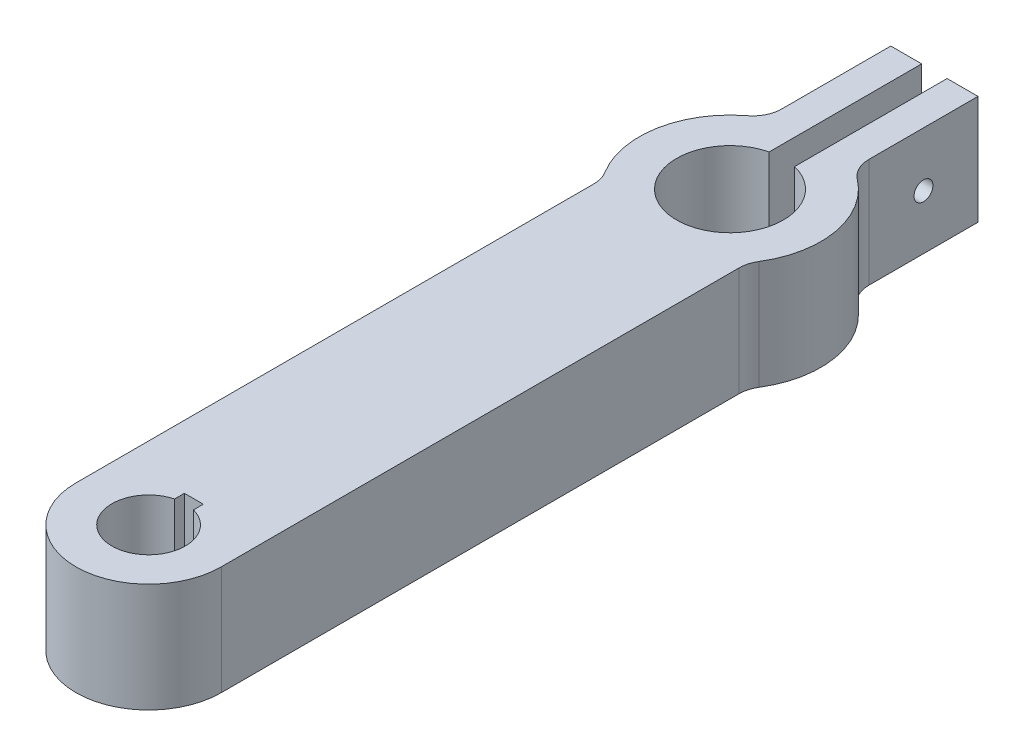
ISO-10303-21;
HEADER;
FILE_DESCRIPTION(('STEP AP214'),'2;1');
FILE_NAME('part.step','',(''),(''),'','','');
FILE_SCHEMA(('AUTOMOTIVE_DESIGN { 1 0 10303 214 1 1 1 1 }'));
ENDSEC;
DATA;
#1=APPLICATION_CONTEXT('core data for automotive mechanical design processes');
#2=APPLICATION_PROTOCOL_DEFINITION('international standard','automotive_design',2000,#1);
#3=PRODUCT_CONTEXT('',#1,'mechanical');
#4=PRODUCT('Part','Part','',(#3));
#5=PRODUCT_RELATED_PRODUCT_CATEGORY('part','',(#4));
#6=PRODUCT_DEFINITION_FORMATION('','',#4);
#7=PRODUCT_DEFINITION_CONTEXT('part definition',#1,'design');
#8=PRODUCT_DEFINITION('design','',#6,#7);
#9=PRODUCT_DEFINITION_SHAPE('','',#8);
#10=(LENGTH_UNIT() NAMED_UNIT(*) SI_UNIT(.MILLI.,.METRE.));
#11=(NAMED_UNIT(*) PLANE_ANGLE_UNIT() SI_UNIT($,.RADIAN.));
#12=(NAMED_UNIT(*) SI_UNIT($,.STERADIAN.) SOLID_ANGLE_UNIT());
#13=UNCERTAINTY_MEASURE_WITH_UNIT(LENGTH_MEASURE(1.E-05),#10,'distance_accuracy_value','');
#14=(GEOMETRIC_REPRESENTATION_CONTEXT(3) GLOBAL_UNCERTAINTY_ASSIGNED_CONTEXT((#13)) GLOBAL_UNIT_ASSIGNED_CONTEXT((#10,
#11,#12)) REPRESENTATION_CONTEXT('',''));
#15=CARTESIAN_POINT('',(0.,0.,0.));
#16=DIRECTION('',(0.,0.,1.));
#17=DIRECTION('',(1.,0.,0.));
#18=AXIS2_PLACEMENT_3D('',#15,#16,#17);
#19=CARTESIAN_POINT('',(-11.557,5.08,-85.725));
#20=DIRECTION('',(0.,0.,1.));
#21=DIRECTION('',(1.,0.,0.));
#22=AXIS2_PLACEMENT_3D('',#19,#20,#21);
#23=PLANE('',#22);
#24=DIRECTION('',(-1.,0.,0.));
#25=VECTOR('',#24,1.);
#26=CARTESIAN_POINT('',(-11.557,0.,-85.725));
#27=LINE('',#26,#25);
#28=CARTESIAN_POINT('',(11.557,0.,-85.725));
#29=VERTEX_POINT('',#28);
#30=CARTESIAN_POINT('',(4.7625,0.,-85.725));
#31=VERTEX_POINT('',#30);
#32=EDGE_CURVE('E500',#29,#31,#27,.T.);
#33=ORIENTED_EDGE('',*,*,#32,.T.);
#34=DIRECTION('',(0.,-1.,0.));
#35=VECTOR('',#34,1.);
#36=CARTESIAN_POINT('',(4.7625,5.08,-85.725));
#37=LINE('',#36,#35);
#38=CARTESIAN_POINT('',(4.7625,5.08,-85.725));
#39=VERTEX_POINT('',#38);
#40=EDGE_CURVE('E493',#39,#31,#37,.T.);
#41=ORIENTED_EDGE('',*,*,#40,.F.);
#42=DIRECTION('',(-1.,0.,0.));
#43=VECTOR('',#42,1.);
#44=CARTESIAN_POINT('',(-11.557,5.08,-85.725));
#45=LINE('',#44,#43);
#46=CARTESIAN_POINT('',(11.557,5.08,-85.725));
#47=VERTEX_POINT('',#46);
#48=EDGE_CURVE('E480',#47,#39,#45,.T.);
#49=ORIENTED_EDGE('',*,*,#48,.F.);
#50=DIRECTION('',(0.,-1.,0.));
#51=VECTOR('',#50,1.);
#52=CARTESIAN_POINT('',(11.557,5.08,-85.725));
#53=LINE('',#52,#51);
#54=EDGE_CURVE('E505',#47,#29,#53,.T.);
#55=ORIENTED_EDGE('',*,*,#54,.T.);
#56=EDGE_LOOP('',(#33,#41,#49,#55));
#57=FACE_BOUND('',#56,.T.);
#58=ADVANCED_FACE('F34',(#57),#23,.F.);
#59=CARTESIAN_POINT('',(35.56,38.1,-181.020403520352));
#60=DIRECTION('',(0.,-1.,0.));
#61=DIRECTION('',(0.,0.,-1.));
#62=AXIS2_PLACEMENT_3D('',#59,#60,#61);
#63=PLANE('',#62);
#64=CARTESIAN_POINT('',(35.56,38.1,-181.020403520352));
#65=DIRECTION('',(0.,-1.,0.));
#66=DIRECTION('',(0.,0.,-1.));
#67=AXIS2_PLACEMENT_3D('',#64,#65,#66);
#68=CIRCLE('',#67,10.16);
#69=CARTESIAN_POINT('',(25.4,38.1,-181.020403520352));
#70=VERTEX_POINT('',#69);
#71=CARTESIAN_POINT('',(26.9393939393939,38.1,-186.397275394206));
#72=VERTEX_POINT('',#71);
#73=EDGE_CURVE('E252',#70,#72,#68,.T.);
#74=ORIENTED_EDGE('',*,*,#73,.T.);
#75=CARTESIAN_POINT('',(0.,38.1,-203.2));
#76=DIRECTION('',(0.,1.,0.));
#77=DIRECTION('',(0.,0.,1.));
#78=AXIS2_PLACEMENT_3D('',#75,#76,#77);
#79=CIRCLE('',#78,31.75);
#80=CARTESIAN_POINT('',(19.2424242424242,38.1,-228.454536409813));
#81=VERTEX_POINT('',#80);
#82=EDGE_CURVE('E255',#72,#81,#79,.T.);
#83=ORIENTED_EDGE('',*,*,#82,.T.);
#84=CARTESIAN_POINT('',(25.4,38.1,-236.535988060953));
#85=DIRECTION('',(0.,-1.,0.));
#86=DIRECTION('',(0.,0.,1.));
#87=AXIS2_PLACEMENT_3D('',#84,#85,#86);
#88=CIRCLE('',#87,10.16);
#89=CARTESIAN_POINT('',(15.24,38.1,-236.535988060953));
#90=VERTEX_POINT('',#89);
#91=EDGE_CURVE('E258',#81,#90,#88,.T.);
#92=ORIENTED_EDGE('',*,*,#91,.T.);
#93=DIRECTION('',(0.,0.,-1.));
#94=VECTOR('',#93,1.);
#95=CARTESIAN_POINT('',(15.24,38.1,-274.635988060953));
#96=LINE('',#95,#94);
#97=CARTESIAN_POINT('',(15.24,38.1,-274.635988060953));
#98=VERTEX_POINT('',#97);
#99=EDGE_CURVE('E260',#90,#98,#96,.T.);
#100=ORIENTED_EDGE('',*,*,#99,.T.);
#101=DIRECTION('',(-1.,0.,0.));
#102=VECTOR('',#101,1.);
#103=CARTESIAN_POINT('',(4.445,38.1,-274.635988060953));
#104=LINE('',#103,#102);
#105=CARTESIAN_POINT('',(4.445,38.1,-274.635988060953));
#106=VERTEX_POINT('',#105);
#107=EDGE_CURVE('E262',#98,#106,#104,.T.);
#108=ORIENTED_EDGE('',*,*,#107,.T.);
#109=DIRECTION('',(0.,0.,1.));
#110=VECTOR('',#109,1.);
#111=CARTESIAN_POINT('',(4.445,38.1,-274.635988060953));
#112=LINE('',#111,#110);
#113=CARTESIAN_POINT('',(4.44499999999998,38.1,-221.332113390336));
#114=VERTEX_POINT('',#113);
#115=EDGE_CURVE('E264',#106,#114,#112,.T.);
#116=ORIENTED_EDGE('',*,*,#115,.T.);
#117=CARTESIAN_POINT('',(0.,38.1,-203.2));
#118=DIRECTION('',(0.,-1.,0.));
#119=DIRECTION('',(0.,0.,1.));
#120=AXIS2_PLACEMENT_3D('',#117,#118,#119);
#121=CIRCLE('',#120,18.669);
#122=CARTESIAN_POINT('',(-4.44499999999999,38.1,-221.332113390336));
#123=VERTEX_POINT('',#122);
#124=EDGE_CURVE('E266',#114,#123,#121,.T.);
#125=ORIENTED_EDGE('',*,*,#124,.T.);
#126=DIRECTION('',(0.,0.,-1.));
#127=VECTOR('',#126,1.);
#128=CARTESIAN_POINT('',(-4.445,38.1,-274.635988060953));
#129=LINE('',#128,#127);
#130=CARTESIAN_POINT('',(-4.445,38.1,-274.635988060953));
#131=VERTEX_POINT('',#130);
#132=EDGE_CURVE('E268',#123,#131,#129,.T.);
#133=ORIENTED_EDGE('',*,*,#132,.T.);
#134=DIRECTION('',(-1.,0.,0.));
#135=VECTOR('',#134,1.);
#136=CARTESIAN_POINT('',(-4.445,38.1,-274.635988060953));
#137=LINE('',#136,#135);
#138=CARTESIAN_POINT('',(-15.24,38.1,-274.635988060953));
#139=VERTEX_POINT('',#138);
#140=EDGE_CURVE('E270',#131,#139,#137,.T.);
#141=ORIENTED_EDGE('',*,*,#140,.T.);
#142=DIRECTION('',(0.,0.,1.));
#143=VECTOR('',#142,1.);
#144=CARTESIAN_POINT('',(-15.24,38.1,-274.635988060953));
#145=LINE('',#144,#143);
#146=CARTESIAN_POINT('',(-15.24,38.1,-236.535988060953));
#147=VERTEX_POINT('',#146);
#148=EDGE_CURVE('E272',#139,#147,#145,.T.);
#149=ORIENTED_EDGE('',*,*,#148,.T.);
#150=CARTESIAN_POINT('',(-25.4,38.1,-236.535988060953));
#151=DIRECTION('',(0.,-1.,0.));
#152=DIRECTION('',(0.,0.,-1.));
#153=AXIS2_PLACEMENT_3D('',#150,#151,#152);
#154=CIRCLE('',#153,10.16);
#155=CARTESIAN_POINT('',(-19.2424242424242,38.1,-228.454536409813));
#156=VERTEX_POINT('',#155);
#157=EDGE_CURVE('E274',#147,#156,#154,.T.);
#158=ORIENTED_EDGE('',*,*,#157,.T.);
#159=CARTESIAN_POINT('',(0.,38.1,-203.2));
#160=DIRECTION('',(0.,1.,0.));
#161=DIRECTION('',(0.,0.,1.));
#162=AXIS2_PLACEMENT_3D('',#159,#160,#161);
#163=CIRCLE('',#162,31.75);
#164=CARTESIAN_POINT('',(-26.9393939393939,38.1,-186.397275394206));
#165=VERTEX_POINT('',#164);
#166=EDGE_CURVE('E276',#156,#165,#163,.T.);
#167=ORIENTED_EDGE('',*,*,#166,.T.);
#168=CARTESIAN_POINT('',(-35.56,38.1,-181.020403520352));
#169=DIRECTION('',(0.,-1.,0.));
#170=DIRECTION('',(0.,0.,1.));
#171=AXIS2_PLACEMENT_3D('',#168,#169,#170);
#172=CIRCLE('',#171,10.16);
#173=CARTESIAN_POINT('',(-25.4,38.1,-181.020403520352));
#174=VERTEX_POINT('',#173);
#175=EDGE_CURVE('E278',#165,#174,#172,.T.);
#176=ORIENTED_EDGE('',*,*,#175,.T.);
#177=DIRECTION('',(0.,0.,1.));
#178=VECTOR('',#177,1.);
#179=CARTESIAN_POINT('',(-25.4,38.1,0.));
#180=LINE('',#179,#178);
#181=CARTESIAN_POINT('',(-25.4,38.1,0.));
#182=VERTEX_POINT('',#181);
#183=EDGE_CURVE('E280',#174,#182,#180,.T.);
#184=ORIENTED_EDGE('',*,*,#183,.T.);
#185=CARTESIAN_POINT('',(0.,38.1,0.));
#186=DIRECTION('',(0.,1.,0.));
#187=DIRECTION('',(0.,0.,1.));
#188=AXIS2_PLACEMENT_3D('',#185,#186,#187);
#189=CIRCLE('',#188,25.4);
#190=CARTESIAN_POINT('',(25.4,38.1,0.));
#191=VERTEX_POINT('',#190);
#192=EDGE_CURVE('E282',#182,#191,#189,.T.);
#193=ORIENTED_EDGE('',*,*,#192,.T.);
#194=DIRECTION('',(0.,0.,-1.));
#195=VECTOR('',#194,1.);
#196=CARTESIAN_POINT('',(25.4,38.1,0.));
#197=LINE('',#196,#195);
#198=EDGE_CURVE('E284',#191,#70,#197,.T.);
#199=ORIENTED_EDGE('',*,*,#198,.T.);
#200=EDGE_LOOP('',(#74,#83,#92,#100,#108,#116,#125,#133,#141,#149,#158,#167,#176,#184,#193,#199));
#201=FACE_BOUND('',#200,.T.);
#202=DIRECTION('',(-1.,0.,0.));
#203=VECTOR('',#202,1.);
#204=CARTESIAN_POINT('',(3.302,38.1,-15.8237055229239));
#205=LINE('',#204,#203);
#206=CARTESIAN_POINT('',(3.302,38.1,-15.8237055229239));
#207=VERTEX_POINT('',#206);
#208=CARTESIAN_POINT('',(-3.302,38.1,-15.8237055229239));
#209=VERTEX_POINT('',#208);
#210=EDGE_CURVE('E238',#207,#209,#205,.T.);
#211=ORIENTED_EDGE('',*,*,#210,.F.);
#212=DIRECTION('',(0.,0.,-1.));
#213=VECTOR('',#212,1.);
#214=CARTESIAN_POINT('',(3.302,38.1,-15.8237055229239));
#215=LINE('',#214,#213);
#216=CARTESIAN_POINT('',(3.302,38.1,-12.3947055229239));
#217=VERTEX_POINT('',#216);
#218=EDGE_CURVE('E223',#217,#207,#215,.T.);
#219=ORIENTED_EDGE('',*,*,#218,.F.);
#220=CARTESIAN_POINT('',(0.,38.1,0.));
#221=DIRECTION('',(0.,1.,0.));
#222=DIRECTION('',(0.,0.,1.));
#223=AXIS2_PLACEMENT_3D('',#220,#221,#222);
#224=CIRCLE('',#223,12.827);
#225=CARTESIAN_POINT('',(-3.302,38.1,-12.3947055229239));
#226=VERTEX_POINT('',#225);
#227=EDGE_CURVE('E237',#226,#217,#224,.T.);
#228=ORIENTED_EDGE('',*,*,#227,.F.);
#229=DIRECTION('',(0.,0.,1.));
#230=VECTOR('',#229,1.);
#231=CARTESIAN_POINT('',(-3.302,38.1,-15.8237055229239));
#232=LINE('',#231,#230);
#233=EDGE_CURVE('E49',#209,#226,#232,.T.);
#234=ORIENTED_EDGE('',*,*,#233,.F.);
#235=EDGE_LOOP('',(#211,#219,#228,#234));
#236=FACE_BOUND('',#235,.T.);
#237=ADVANCED_FACE('F236',(#201,#236),#63,.F.);
#238=CARTESIAN_POINT('',(35.56,0.,-181.020403520352));
#239=DIRECTION('',(0.,-1.,0.));
#240=DIRECTION('',(0.,0.,-1.));
#241=AXIS2_PLACEMENT_3D('',#238,#239,#240);
#242=PLANE('',#241);
#243=DIRECTION('',(0.,0.,1.));
#244=VECTOR('',#243,1.);
#245=CARTESIAN_POINT('',(3.302,0.,-15.8237055229239));
#246=LINE('',#245,#244);
#247=CARTESIAN_POINT('',(3.302,0.,-15.8237055229239));
#248=VERTEX_POINT('',#247);
#249=CARTESIAN_POINT('',(3.30200000000001,0.,-12.3947055229239));
#250=VERTEX_POINT('',#249);
#251=EDGE_CURVE('E226',#248,#250,#246,.T.);
#252=ORIENTED_EDGE('',*,*,#251,.F.);
#253=DIRECTION('',(1.,0.,0.));
#254=VECTOR('',#253,1.);
#255=CARTESIAN_POINT('',(3.302,0.,-15.8237055229239));
#256=LINE('',#255,#254);
#257=CARTESIAN_POINT('',(-3.302,0.,-15.8237055229239));
#258=VERTEX_POINT('',#257);
#259=EDGE_CURVE('E786',#258,#248,#256,.T.);
#260=ORIENTED_EDGE('',*,*,#259,.F.);
#261=DIRECTION('',(0.,0.,-1.));
#262=VECTOR('',#261,1.);
#263=CARTESIAN_POINT('',(-3.302,0.,-15.8237055229239));
#264=LINE('',#263,#262);
#265=CARTESIAN_POINT('',(-3.302,0.,-12.3947055229239));
#266=VERTEX_POINT('',#265);
#267=EDGE_CURVE('E784',#266,#258,#264,.T.);
#268=ORIENTED_EDGE('',*,*,#267,.F.);
#269=CARTESIAN_POINT('',(0.,0.,0.));
#270=DIRECTION('',(0.,1.,0.));
#271=DIRECTION('',(0.,0.,1.));
#272=AXIS2_PLACEMENT_3D('',#269,#270,#271);
#273=CIRCLE('',#272,12.827);
#274=EDGE_CURVE('E242',#266,#250,#273,.T.);
#275=ORIENTED_EDGE('',*,*,#274,.T.);
#276=EDGE_LOOP('',(#252,#260,#268,#275));
#277=FACE_BOUND('',#276,.T.);
#278=DIRECTION('',(0.,0.,1.));
#279=VECTOR('',#278,1.);
#280=CARTESIAN_POINT('',(4.7625,0.,-85.725));
#281=LINE('',#280,#279);
#282=CARTESIAN_POINT('',(4.7625,0.,-47.625));
#283=VERTEX_POINT('',#282);
#284=EDGE_CURVE('E794',#31,#283,#281,.T.);
#285=ORIENTED_EDGE('',*,*,#284,.F.);
#286=ORIENTED_EDGE('',*,*,#32,.F.);
#287=DIRECTION('',(0.,0.,1.));
#288=VECTOR('',#287,1.);
#289=CARTESIAN_POINT('',(11.557,0.,-85.725));
#290=LINE('',#289,#288);
#291=CARTESIAN_POINT('',(11.557,0.,-117.475));
#292=VERTEX_POINT('',#291);
#293=EDGE_CURVE('E496',#292,#29,#290,.T.);
#294=ORIENTED_EDGE('',*,*,#293,.F.);
#295=DIRECTION('',(1.,0.,0.));
#296=VECTOR('',#295,1.);
#297=CARTESIAN_POINT('',(-11.557,0.,-117.475));
#298=LINE('',#297,#296);
#299=CARTESIAN_POINT('',(-11.557,0.,-117.475));
#300=VERTEX_POINT('',#299);
#301=EDGE_CURVE('E492',#300,#292,#298,.T.);
#302=ORIENTED_EDGE('',*,*,#301,.F.);
#303=DIRECTION('',(0.,0.,-1.));
#304=VECTOR('',#303,1.);
#305=CARTESIAN_POINT('',(-11.557,0.,-85.725));
#306=LINE('',#305,#304);
#307=CARTESIAN_POINT('',(-11.557,0.,-85.725));
#308=VERTEX_POINT('',#307);
#309=EDGE_CURVE('E490',#308,#300,#306,.T.);
#310=ORIENTED_EDGE('',*,*,#309,.F.);
#311=CARTESIAN_POINT('',(-4.7625,0.,-85.725));
#312=VERTEX_POINT('',#311);
#313=EDGE_CURVE('E499',#312,#308,#27,.T.);
#314=ORIENTED_EDGE('',*,*,#313,.F.);
#315=DIRECTION('',(0.,0.,-1.));
#316=VECTOR('',#315,1.);
#317=CARTESIAN_POINT('',(-4.7625,0.,-85.725));
#318=LINE('',#317,#316);
#319=CARTESIAN_POINT('',(-4.7625,0.,-47.625));
#320=VERTEX_POINT('',#319);
#321=EDGE_CURVE('E800',#320,#312,#318,.T.);
#322=ORIENTED_EDGE('',*,*,#321,.F.);
#323=DIRECTION('',(-1.,0.,0.));
#324=VECTOR('',#323,1.);
#325=CARTESIAN_POINT('',(4.7625,0.,-47.625));
#326=LINE('',#325,#324);
#327=EDGE_CURVE('E806',#283,#320,#326,.T.);
#328=ORIENTED_EDGE('',*,*,#327,.F.);
#329=EDGE_LOOP('',(#285,#286,#294,#302,#310,#314,#322,#328));
#330=FACE_BOUND('',#329,.T.);
#331=CARTESIAN_POINT('',(35.56,0.,-181.020403520352));
#332=DIRECTION('',(0.,-1.,0.));
#333=DIRECTION('',(0.,0.,-1.));
#334=AXIS2_PLACEMENT_3D('',#331,#332,#333);
#335=CIRCLE('',#334,10.16);
#336=CARTESIAN_POINT('',(25.4,0.,-181.020403520352));
#337=VERTEX_POINT('',#336);
#338=CARTESIAN_POINT('',(26.9393939393939,0.,-186.397275394206));
#339=VERTEX_POINT('',#338);
#340=EDGE_CURVE('E241',#337,#339,#335,.T.);
#341=ORIENTED_EDGE('',*,*,#340,.F.);
#342=DIRECTION('',(0.,0.,-1.));
#343=VECTOR('',#342,1.);
#344=CARTESIAN_POINT('',(25.4,0.,0.));
#345=LINE('',#344,#343);
#346=CARTESIAN_POINT('',(25.4,0.,0.));
#347=VERTEX_POINT('',#346);
#348=EDGE_CURVE('E256',#347,#337,#345,.T.);
#349=ORIENTED_EDGE('',*,*,#348,.F.);
#350=CARTESIAN_POINT('',(0.,0.,0.));
#351=DIRECTION('',(0.,1.,0.));
#352=DIRECTION('',(0.,0.,1.));
#353=AXIS2_PLACEMENT_3D('',#350,#351,#352);
#354=CIRCLE('',#353,25.4);
#355=CARTESIAN_POINT('',(-25.4,0.,0.));
#356=VERTEX_POINT('',#355);
#357=EDGE_CURVE('E312',#356,#347,#354,.T.);
#358=ORIENTED_EDGE('',*,*,#357,.F.);
#359=DIRECTION('',(0.,0.,1.));
#360=VECTOR('',#359,1.);
#361=CARTESIAN_POINT('',(-25.4,0.,0.));
#362=LINE('',#361,#360);
#363=CARTESIAN_POINT('',(-25.4,0.,-181.020403520352));
#364=VERTEX_POINT('',#363);
#365=EDGE_CURVE('E310',#364,#356,#362,.T.);
#366=ORIENTED_EDGE('',*,*,#365,.F.);
#367=CARTESIAN_POINT('',(-35.56,0.,-181.020403520352));
#368=DIRECTION('',(0.,-1.,0.));
#369=DIRECTION('',(0.,0.,1.));
#370=AXIS2_PLACEMENT_3D('',#367,#368,#369);
#371=CIRCLE('',#370,10.16);
#372=CARTESIAN_POINT('',(-26.9393939393939,0.,-186.397275394206));
#373=VERTEX_POINT('',#372);
#374=EDGE_CURVE('E308',#373,#364,#371,.T.);
#375=ORIENTED_EDGE('',*,*,#374,.F.);
#376=CARTESIAN_POINT('',(0.,0.,-203.2));
#377=DIRECTION('',(0.,1.,0.));
#378=DIRECTION('',(0.,0.,1.));
#379=AXIS2_PLACEMENT_3D('',#376,#377,#378);
#380=CIRCLE('',#379,31.75);
#381=CARTESIAN_POINT('',(-19.2424242424242,0.,-228.454536409813));
#382=VERTEX_POINT('',#381);
#383=EDGE_CURVE('E306',#382,#373,#380,.T.);
#384=ORIENTED_EDGE('',*,*,#383,.F.);
#385=CARTESIAN_POINT('',(-25.4,0.,-236.535988060953));
#386=DIRECTION('',(0.,-1.,0.));
#387=DIRECTION('',(0.,0.,-1.));
#388=AXIS2_PLACEMENT_3D('',#385,#386,#387);
#389=CIRCLE('',#388,10.16);
#390=CARTESIAN_POINT('',(-15.24,0.,-236.535988060953));
#391=VERTEX_POINT('',#390);
#392=EDGE_CURVE('E304',#391,#382,#389,.T.);
#393=ORIENTED_EDGE('',*,*,#392,.F.);
#394=DIRECTION('',(0.,0.,1.));
#395=VECTOR('',#394,1.);
#396=CARTESIAN_POINT('',(-15.24,0.,-274.635988060953));
#397=LINE('',#396,#395);
#398=CARTESIAN_POINT('',(-15.24,0.,-274.635988060953));
#399=VERTEX_POINT('',#398);
#400=EDGE_CURVE('E302',#399,#391,#397,.T.);
#401=ORIENTED_EDGE('',*,*,#400,.F.);
#402=DIRECTION('',(-1.,0.,0.));
#403=VECTOR('',#402,1.);
#404=CARTESIAN_POINT('',(-4.445,0.,-274.635988060953));
#405=LINE('',#404,#403);
#406=CARTESIAN_POINT('',(-4.445,0.,-274.635988060953));
#407=VERTEX_POINT('',#406);
#408=EDGE_CURVE('E300',#407,#399,#405,.T.);
#409=ORIENTED_EDGE('',*,*,#408,.F.);
#410=DIRECTION('',(0.,0.,-1.));
#411=VECTOR('',#410,1.);
#412=CARTESIAN_POINT('',(-4.445,0.,-274.635988060953));
#413=LINE('',#412,#411);
#414=CARTESIAN_POINT('',(-4.44499999999999,0.,-221.332113390336));
#415=VERTEX_POINT('',#414);
#416=EDGE_CURVE('E298',#415,#407,#413,.T.);
#417=ORIENTED_EDGE('',*,*,#416,.F.);
#418=CARTESIAN_POINT('',(0.,0.,-203.2));
#419=DIRECTION('',(0.,-1.,0.));
#420=DIRECTION('',(0.,0.,1.));
#421=AXIS2_PLACEMENT_3D('',#418,#419,#420);
#422=CIRCLE('',#421,18.669);
#423=CARTESIAN_POINT('',(4.44499999999998,0.,-221.332113390336));
#424=VERTEX_POINT('',#423);
#425=EDGE_CURVE('E296',#424,#415,#422,.T.);
#426=ORIENTED_EDGE('',*,*,#425,.F.);
#427=DIRECTION('',(0.,0.,1.));
#428=VECTOR('',#427,1.);
#429=CARTESIAN_POINT('',(4.445,0.,-274.635988060953));
#430=LINE('',#429,#428);
#431=CARTESIAN_POINT('',(4.445,0.,-274.635988060953));
#432=VERTEX_POINT('',#431);
#433=EDGE_CURVE('E294',#432,#424,#430,.T.);
#434=ORIENTED_EDGE('',*,*,#433,.F.);
#435=DIRECTION('',(-1.,0.,0.));
#436=VECTOR('',#435,1.);
#437=CARTESIAN_POINT('',(4.445,0.,-274.635988060953));
#438=LINE('',#437,#436);
#439=CARTESIAN_POINT('',(15.24,0.,-274.635988060953));
#440=VERTEX_POINT('',#439);
#441=EDGE_CURVE('E292',#440,#432,#438,.T.);
#442=ORIENTED_EDGE('',*,*,#441,.F.);
#443=DIRECTION('',(0.,0.,-1.));
#444=VECTOR('',#443,1.);
#445=CARTESIAN_POINT('',(15.24,0.,-274.635988060953));
#446=LINE('',#445,#444);
#447=CARTESIAN_POINT('',(15.24,0.,-236.535988060953));
#448=VERTEX_POINT('',#447);
#449=EDGE_CURVE('E290',#448,#440,#446,.T.);
#450=ORIENTED_EDGE('',*,*,#449,.F.);
#451=CARTESIAN_POINT('',(25.4,0.,-236.535988060953));
#452=DIRECTION('',(0.,-1.,0.));
#453=DIRECTION('',(0.,0.,1.));
#454=AXIS2_PLACEMENT_3D('',#451,#452,#453);
#455=CIRCLE('',#454,10.16);
#456=CARTESIAN_POINT('',(19.2424242424242,0.,-228.454536409813));
#457=VERTEX_POINT('',#456);
#458=EDGE_CURVE('E288',#457,#448,#455,.T.);
#459=ORIENTED_EDGE('',*,*,#458,.F.);
#460=CARTESIAN_POINT('',(0.,0.,-203.2));
#461=DIRECTION('',(0.,1.,0.));
#462=DIRECTION('',(0.,0.,1.));
#463=AXIS2_PLACEMENT_3D('',#460,#461,#462);
#464=CIRCLE('',#463,31.75);
#465=EDGE_CURVE('E245',#339,#457,#464,.T.);
#466=ORIENTED_EDGE('',*,*,#465,.F.);
#467=EDGE_LOOP('',(#341,#349,#358,#366,#375,#384,#393,#401,#409,#417,#426,#434,#442,#450,#459,#466));
#468=FACE_BOUND('',#467,.T.);
#469=ADVANCED_FACE('F366',(#277,#330,#468),#242,.T.);
#470=CARTESIAN_POINT('',(35.56,38.1,-181.020403520352));
#471=DIRECTION('',(0.,-1.,0.));
#472=DIRECTION('',(0.,0.,-1.));
#473=AXIS2_PLACEMENT_3D('',#470,#471,#472);
#474=CYLINDRICAL_SURFACE('',#473,10.16);
#475=ORIENTED_EDGE('',*,*,#340,.T.);
#476=DIRECTION('',(0.,-1.,0.));
#477=VECTOR('',#476,1.);
#478=CARTESIAN_POINT('',(26.9393939393939,38.1,-186.397275394206));
#479=LINE('',#478,#477);
#480=EDGE_CURVE('E11',#72,#339,#479,.T.);
#481=ORIENTED_EDGE('',*,*,#480,.F.);
#482=ORIENTED_EDGE('',*,*,#73,.F.);
#483=DIRECTION('',(0.,-1.,0.));
#484=VECTOR('',#483,1.);
#485=CARTESIAN_POINT('',(25.4,38.1,-181.020403520352));
#486=LINE('',#485,#484);
#487=EDGE_CURVE('E285',#70,#337,#486,.T.);
#488=ORIENTED_EDGE('',*,*,#487,.T.);
#489=EDGE_LOOP('',(#475,#481,#482,#488));
#490=FACE_BOUND('',#489,.T.);
#491=ADVANCED_FACE('F36',(#490),#474,.F.);
#492=CARTESIAN_POINT('',(0.,38.1,-203.2));
#493=DIRECTION('',(0.,-1.,0.));
#494=DIRECTION('',(0.,0.,-1.));
#495=AXIS2_PLACEMENT_3D('',#492,#493,#494);
#496=CYLINDRICAL_SURFACE('',#495,31.75);
#497=ORIENTED_EDGE('',*,*,#465,.T.);
#498=DIRECTION('',(0.,-1.,0.));
#499=VECTOR('',#498,1.);
#500=CARTESIAN_POINT('',(19.2424242424242,38.1,-228.454536409813));
#501=LINE('',#500,#499);
#502=EDGE_CURVE('E42',#81,#457,#501,.T.);
#503=ORIENTED_EDGE('',*,*,#502,.F.);
#504=ORIENTED_EDGE('',*,*,#82,.F.);
#505=ORIENTED_EDGE('',*,*,#480,.T.);
#506=EDGE_LOOP('',(#497,#503,#504,#505));
#507=FACE_BOUND('',#506,.T.);
#508=ADVANCED_FACE('F382',(#507),#496,.T.);
#509=CARTESIAN_POINT('',(25.4,38.1,-236.535988060953));
#510=DIRECTION('',(0.,-1.,0.));
#511=DIRECTION('',(0.,0.,-1.));
#512=AXIS2_PLACEMENT_3D('',#509,#510,#511);
#513=CYLINDRICAL_SURFACE('',#512,10.16);
#514=ORIENTED_EDGE('',*,*,#458,.T.);
#515=DIRECTION('',(0.,-1.,0.));
#516=VECTOR('',#515,1.);
#517=CARTESIAN_POINT('',(15.24,38.1,-236.535988060953));
#518=LINE('',#517,#516);
#519=EDGE_CURVE('E353',#90,#448,#518,.T.);
#520=ORIENTED_EDGE('',*,*,#519,.F.);
#521=ORIENTED_EDGE('',*,*,#91,.F.);
#522=ORIENTED_EDGE('',*,*,#502,.T.);
#523=EDGE_LOOP('',(#514,#520,#521,#522));
#524=FACE_BOUND('',#523,.T.);
#525=ADVANCED_FACE('F360',(#524),#513,.F.);
#526=CARTESIAN_POINT('',(15.24,38.1,-274.635988060953));
#527=DIRECTION('',(-1.,0.,0.));
#528=DIRECTION('',(0.,0.,1.));
#529=AXIS2_PLACEMENT_3D('',#526,#527,#528);
#530=PLANE('',#529);
#531=CARTESIAN_POINT('',(15.24,19.05,-255.585988060953));
#532=DIRECTION('',(-1.,0.,0.));
#533=DIRECTION('',(0.,0.,1.));
#534=AXIS2_PLACEMENT_3D('',#531,#532,#533);
#535=CIRCLE('',#534,3.30200000000004);
#536=CARTESIAN_POINT('',(15.24,19.05,-252.283988060953));
#537=VERTEX_POINT('',#536);
#538=EDGE_CURVE('E513',#537,#537,#535,.F.);
#539=ORIENTED_EDGE('',*,*,#538,.F.);
#540=EDGE_LOOP('',(#539));
#541=FACE_BOUND('',#540,.T.);
#542=ORIENTED_EDGE('',*,*,#449,.T.);
#543=DIRECTION('',(0.,-1.,0.));
#544=VECTOR('',#543,1.);
#545=CARTESIAN_POINT('',(15.24,38.1,-274.635988060953));
#546=LINE('',#545,#544);
#547=EDGE_CURVE('E350',#98,#440,#546,.T.);
#548=ORIENTED_EDGE('',*,*,#547,.F.);
#549=ORIENTED_EDGE('',*,*,#99,.F.);
#550=ORIENTED_EDGE('',*,*,#519,.T.);
#551=EDGE_LOOP('',(#542,#548,#549,#550));
#552=FACE_BOUND('',#551,.T.);
#553=ADVANCED_FACE('F371',(#541,#552),#530,.F.);
#554=CARTESIAN_POINT('',(4.445,38.1,-274.635988060953));
#555=DIRECTION('',(0.,0.,1.));
#556=DIRECTION('',(1.,0.,0.));
#557=AXIS2_PLACEMENT_3D('',#554,#555,#556);
#558=PLANE('',#557);
#559=ORIENTED_EDGE('',*,*,#441,.T.);
#560=DIRECTION('',(0.,-1.,0.));
#561=VECTOR('',#560,1.);
#562=CARTESIAN_POINT('',(4.445,38.1,-274.635988060953));
#563=LINE('',#562,#561);
#564=EDGE_CURVE('E347',#106,#432,#563,.T.);
#565=ORIENTED_EDGE('',*,*,#564,.F.);
#566=ORIENTED_EDGE('',*,*,#107,.F.);
#567=ORIENTED_EDGE('',*,*,#547,.T.);
#568=EDGE_LOOP('',(#559,#565,#566,#567));
#569=FACE_BOUND('',#568,.T.);
#570=ADVANCED_FACE('F375',(#569),#558,.F.);
#571=CARTESIAN_POINT('',(4.445,38.1,-274.635988060953));
#572=DIRECTION('',(1.,0.,0.));
#573=DIRECTION('',(0.,0.,-1.));
#574=AXIS2_PLACEMENT_3D('',#571,#572,#573);
#575=PLANE('',#574);
#576=CARTESIAN_POINT('',(4.44499999999999,19.05,-255.585988060953));
#577=DIRECTION('',(1.,0.,0.));
#578=DIRECTION('',(0.,0.,-1.));
#579=AXIS2_PLACEMENT_3D('',#576,#577,#578);
#580=CIRCLE('',#579,3.30200000000004);
#581=CARTESIAN_POINT('',(4.44499999999999,19.05,-252.283988060953));
#582=VERTEX_POINT('',#581);
#583=EDGE_CURVE('E247',#582,#582,#580,.T.);
#584=ORIENTED_EDGE('',*,*,#583,.T.);
#585=EDGE_LOOP('',(#584));
#586=FACE_BOUND('',#585,.T.);
#587=ORIENTED_EDGE('',*,*,#433,.T.);
#588=DIRECTION('',(0.,-1.,0.));
#589=VECTOR('',#588,1.);
#590=CARTESIAN_POINT('',(4.44499999999998,38.1,-221.332113390336));
#591=LINE('',#590,#589);
#592=EDGE_CURVE('E344',#114,#424,#591,.T.);
#593=ORIENTED_EDGE('',*,*,#592,.F.);
#594=ORIENTED_EDGE('',*,*,#115,.F.);
#595=ORIENTED_EDGE('',*,*,#564,.T.);
#596=EDGE_LOOP('',(#587,#593,#594,#595));
#597=FACE_BOUND('',#596,.T.);
#598=ADVANCED_FACE('F435',(#586,#597),#575,.F.);
#599=CARTESIAN_POINT('',(0.,38.1,-203.2));
#600=DIRECTION('',(0.,-1.,0.));
#601=DIRECTION('',(0.,0.,-1.));
#602=AXIS2_PLACEMENT_3D('',#599,#600,#601);
#603=CYLINDRICAL_SURFACE('',#602,18.669);
#604=ORIENTED_EDGE('',*,*,#425,.T.);
#605=DIRECTION('',(0.,-1.,0.));
#606=VECTOR('',#605,1.);
#607=CARTESIAN_POINT('',(-4.44499999999999,38.1,-221.332113390336));
#608=LINE('',#607,#606);
#609=EDGE_CURVE('E341',#123,#415,#608,.T.);
#610=ORIENTED_EDGE('',*,*,#609,.F.);
#611=ORIENTED_EDGE('',*,*,#124,.F.);
#612=ORIENTED_EDGE('',*,*,#592,.T.);
#613=EDGE_LOOP('',(#604,#610,#611,#612));
#614=FACE_BOUND('',#613,.T.);
#615=ADVANCED_FACE('F432',(#614),#603,.F.);
#616=CARTESIAN_POINT('',(-4.445,38.1,-274.635988060953));
#617=DIRECTION('',(-1.,0.,0.));
#618=DIRECTION('',(0.,0.,1.));
#619=AXIS2_PLACEMENT_3D('',#616,#617,#618);
#620=PLANE('',#619);
#621=CARTESIAN_POINT('',(-4.44499999999999,19.05,-255.585988060953));
#622=DIRECTION('',(-1.,0.,0.));
#623=DIRECTION('',(0.,0.,1.));
#624=AXIS2_PLACEMENT_3D('',#621,#622,#623);
#625=CIRCLE('',#624,3.30200000000004);
#626=CARTESIAN_POINT('',(-4.44499999999999,19.05,-252.283988060953));
#627=VERTEX_POINT('',#626);
#628=EDGE_CURVE('E515',#627,#627,#625,.T.);
#629=ORIENTED_EDGE('',*,*,#628,.T.);
#630=EDGE_LOOP('',(#629));
#631=FACE_BOUND('',#630,.T.);
#632=ORIENTED_EDGE('',*,*,#416,.T.);
#633=DIRECTION('',(0.,-1.,0.));
#634=VECTOR('',#633,1.);
#635=CARTESIAN_POINT('',(-4.445,38.1,-274.635988060953));
#636=LINE('',#635,#634);
#637=EDGE_CURVE('E338',#131,#407,#636,.T.);
#638=ORIENTED_EDGE('',*,*,#637,.F.);
#639=ORIENTED_EDGE('',*,*,#132,.F.);
#640=ORIENTED_EDGE('',*,*,#609,.T.);
#641=EDGE_LOOP('',(#632,#638,#639,#640));
#642=FACE_BOUND('',#641,.T.);
#643=ADVANCED_FACE('F428',(#631,#642),#620,.F.);
#644=CARTESIAN_POINT('',(-4.445,38.1,-274.635988060953));
#645=DIRECTION('',(0.,0.,1.));
#646=DIRECTION('',(1.,0.,0.));
#647=AXIS2_PLACEMENT_3D('',#644,#645,#646);
#648=PLANE('',#647);
#649=ORIENTED_EDGE('',*,*,#408,.T.);
#650=DIRECTION('',(0.,-1.,0.));
#651=VECTOR('',#650,1.);
#652=CARTESIAN_POINT('',(-15.24,38.1,-274.635988060953));
#653=LINE('',#652,#651);
#654=EDGE_CURVE('E335',#139,#399,#653,.T.);
#655=ORIENTED_EDGE('',*,*,#654,.F.);
#656=ORIENTED_EDGE('',*,*,#140,.F.);
#657=ORIENTED_EDGE('',*,*,#637,.T.);
#658=EDGE_LOOP('',(#649,#655,#656,#657));
#659=FACE_BOUND('',#658,.T.);
#660=ADVANCED_FACE('F424',(#659),#648,.F.);
#661=CARTESIAN_POINT('',(-15.24,38.1,-274.635988060953));
#662=DIRECTION('',(1.,0.,0.));
#663=DIRECTION('',(0.,0.,-1.));
#664=AXIS2_PLACEMENT_3D('',#661,#662,#663);
#665=PLANE('',#664);
#666=CARTESIAN_POINT('',(-15.24,19.05,-255.585988060953));
#667=DIRECTION('',(-1.,0.,0.));
#668=DIRECTION('',(0.,0.,1.));
#669=AXIS2_PLACEMENT_3D('',#666,#667,#668);
#670=CIRCLE('',#669,3.30200000000004);
#671=CARTESIAN_POINT('',(-15.24,19.05,-252.283988060953));
#672=VERTEX_POINT('',#671);
#673=EDGE_CURVE('E504',#672,#672,#670,.T.);
#674=ORIENTED_EDGE('',*,*,#673,.F.);
#675=EDGE_LOOP('',(#674));
#676=FACE_BOUND('',#675,.T.);
#677=ORIENTED_EDGE('',*,*,#400,.T.);
#678=DIRECTION('',(0.,-1.,0.));
#679=VECTOR('',#678,1.);
#680=CARTESIAN_POINT('',(-15.24,38.1,-236.535988060953));
#681=LINE('',#680,#679);
#682=EDGE_CURVE('E332',#147,#391,#681,.T.);
#683=ORIENTED_EDGE('',*,*,#682,.F.);
#684=ORIENTED_EDGE('',*,*,#148,.F.);
#685=ORIENTED_EDGE('',*,*,#654,.T.);
#686=EDGE_LOOP('',(#677,#683,#684,#685));
#687=FACE_BOUND('',#686,.T.);
#688=ADVANCED_FACE('F419',(#676,#687),#665,.F.);
#689=CARTESIAN_POINT('',(-25.4,38.1,-236.535988060953));
#690=DIRECTION('',(0.,-1.,0.));
#691=DIRECTION('',(0.,0.,-1.));
#692=AXIS2_PLACEMENT_3D('',#689,#690,#691);
#693=CYLINDRICAL_SURFACE('',#692,10.16);
#694=ORIENTED_EDGE('',*,*,#392,.T.);
#695=DIRECTION('',(0.,-1.,0.));
#696=VECTOR('',#695,1.);
#697=CARTESIAN_POINT('',(-19.2424242424242,38.1,-228.454536409813));
#698=LINE('',#697,#696);
#699=EDGE_CURVE('E329',#156,#382,#698,.T.);
#700=ORIENTED_EDGE('',*,*,#699,.F.);
#701=ORIENTED_EDGE('',*,*,#157,.F.);
#702=ORIENTED_EDGE('',*,*,#682,.T.);
#703=EDGE_LOOP('',(#694,#700,#701,#702));
#704=FACE_BOUND('',#703,.T.);
#705=ADVANCED_FACE('F413',(#704),#693,.F.);
#706=CARTESIAN_POINT('',(0.,38.1,-203.2));
#707=DIRECTION('',(0.,-1.,0.));
#708=DIRECTION('',(0.,0.,-1.));
#709=AXIS2_PLACEMENT_3D('',#706,#707,#708);
#710=CYLINDRICAL_SURFACE('',#709,31.75);
#711=ORIENTED_EDGE('',*,*,#383,.T.);
#712=DIRECTION('',(0.,-1.,0.));
#713=VECTOR('',#712,1.);
#714=CARTESIAN_POINT('',(-26.9393939393939,38.1,-186.397275394206));
#715=LINE('',#714,#713);
#716=EDGE_CURVE('E326',#165,#373,#715,.T.);
#717=ORIENTED_EDGE('',*,*,#716,.F.);
#718=ORIENTED_EDGE('',*,*,#166,.F.);
#719=ORIENTED_EDGE('',*,*,#699,.T.);
#720=EDGE_LOOP('',(#711,#717,#718,#719));
#721=FACE_BOUND('',#720,.T.);
#722=ADVANCED_FACE('F409',(#721),#710,.T.);
#723=CARTESIAN_POINT('',(-35.56,38.1,-181.020403520352));
#724=DIRECTION('',(0.,-1.,0.));
#725=DIRECTION('',(0.,0.,-1.));
#726=AXIS2_PLACEMENT_3D('',#723,#724,#725);
#727=CYLINDRICAL_SURFACE('',#726,10.16);
#728=ORIENTED_EDGE('',*,*,#374,.T.);
#729=DIRECTION('',(0.,-1.,0.));
#730=VECTOR('',#729,1.);
#731=CARTESIAN_POINT('',(-25.4,38.1,-181.020403520352));
#732=LINE('',#731,#730);
#733=EDGE_CURVE('E323',#174,#364,#732,.T.);
#734=ORIENTED_EDGE('',*,*,#733,.F.);
#735=ORIENTED_EDGE('',*,*,#175,.F.);
#736=ORIENTED_EDGE('',*,*,#716,.T.);
#737=EDGE_LOOP('',(#728,#734,#735,#736));
#738=FACE_BOUND('',#737,.T.);
#739=ADVANCED_FACE('F404',(#738),#727,.F.);
#740=CARTESIAN_POINT('',(-25.4,38.1,0.));
#741=DIRECTION('',(1.,0.,0.));
#742=DIRECTION('',(0.,0.,-1.));
#743=AXIS2_PLACEMENT_3D('',#740,#741,#742);
#744=PLANE('',#743);
#745=ORIENTED_EDGE('',*,*,#365,.T.);
#746=DIRECTION('',(0.,-1.,0.));
#747=VECTOR('',#746,1.);
#748=CARTESIAN_POINT('',(-25.4,38.1,0.));
#749=LINE('',#748,#747);
#750=EDGE_CURVE('E320',#182,#356,#749,.T.);
#751=ORIENTED_EDGE('',*,*,#750,.F.);
#752=ORIENTED_EDGE('',*,*,#183,.F.);
#753=ORIENTED_EDGE('',*,*,#733,.T.);
#754=EDGE_LOOP('',(#745,#751,#752,#753));
#755=FACE_BOUND('',#754,.T.);
#756=ADVANCED_FACE('F398',(#755),#744,.F.);
#757=CARTESIAN_POINT('',(0.,38.1,0.));
#758=DIRECTION('',(0.,-1.,0.));
#759=DIRECTION('',(0.,0.,-1.));
#760=AXIS2_PLACEMENT_3D('',#757,#758,#759);
#761=CYLINDRICAL_SURFACE('',#760,25.4);
#762=ORIENTED_EDGE('',*,*,#357,.T.);
#763=DIRECTION('',(0.,-1.,0.));
#764=VECTOR('',#763,1.);
#765=CARTESIAN_POINT('',(25.4,38.1,0.));
#766=LINE('',#765,#764);
#767=EDGE_CURVE('E317',#191,#347,#766,.T.);
#768=ORIENTED_EDGE('',*,*,#767,.F.);
#769=ORIENTED_EDGE('',*,*,#192,.F.);
#770=ORIENTED_EDGE('',*,*,#750,.T.);
#771=EDGE_LOOP('',(#762,#768,#769,#770));
#772=FACE_BOUND('',#771,.T.);
#773=ADVANCED_FACE('F394',(#772),#761,.T.);
#774=CARTESIAN_POINT('',(25.4,38.1,0.));
#775=DIRECTION('',(-1.,0.,0.));
#776=DIRECTION('',(0.,0.,1.));
#777=AXIS2_PLACEMENT_3D('',#774,#775,#776);
#778=PLANE('',#777);
#779=ORIENTED_EDGE('',*,*,#348,.T.);
#780=ORIENTED_EDGE('',*,*,#487,.F.);
#781=ORIENTED_EDGE('',*,*,#198,.F.);
#782=ORIENTED_EDGE('',*,*,#767,.T.);
#783=EDGE_LOOP('',(#779,#780,#781,#782));
#784=FACE_BOUND('',#783,.T.);
#785=ADVANCED_FACE('F389',(#784),#778,.F.);
#786=CARTESIAN_POINT('',(0.,38.1,0.));
#787=DIRECTION('',(0.,-1.,0.));
#788=DIRECTION('',(0.,0.,-1.));
#789=AXIS2_PLACEMENT_3D('',#786,#787,#788);
#790=CYLINDRICAL_SURFACE('',#789,12.827);
#791=DIRECTION('',(0.,-1.,0.));
#792=VECTOR('',#791,1.);
#793=CARTESIAN_POINT('',(3.302,38.1,-12.3947055229239));
#794=LINE('',#793,#792);
#795=EDGE_CURVE('E220',#217,#250,#794,.T.);
#796=ORIENTED_EDGE('',*,*,#795,.T.);
#797=ORIENTED_EDGE('',*,*,#274,.F.);
#798=DIRECTION('',(0.,-1.,0.));
#799=VECTOR('',#798,1.);
#800=CARTESIAN_POINT('',(-3.302,38.1,-12.3947055229239));
#801=LINE('',#800,#799);
#802=EDGE_CURVE('E231',#266,#226,#801,.F.);
#803=ORIENTED_EDGE('',*,*,#802,.T.);
#804=ORIENTED_EDGE('',*,*,#227,.T.);
#805=EDGE_LOOP('',(#796,#797,#803,#804));
#806=FACE_BOUND('',#805,.T.);
#807=ADVANCED_FACE('F240',(#806),#790,.F.);
#808=CARTESIAN_POINT('',(24.579466365912,19.05,-255.585988060953));
#809=DIRECTION('',(-1.,0.,0.));
#810=DIRECTION('',(0.,0.,1.));
#811=AXIS2_PLACEMENT_3D('',#808,#809,#810);
#812=CYLINDRICAL_SURFACE('',#811,3.30200000000004);
#813=ORIENTED_EDGE('',*,*,#673,.T.);
#814=EDGE_LOOP('',(#813));
#815=FACE_BOUND('',#814,.T.);
#816=ORIENTED_EDGE('',*,*,#628,.F.);
#817=EDGE_LOOP('',(#816));
#818=FACE_BOUND('',#817,.T.);
#819=ADVANCED_FACE('F522',(#815,#818),#812,.F.);
#820=CARTESIAN_POINT('',(15.24,19.05,-252.283988060953));
#821=CARTESIAN_POINT('',(15.1275520833333,19.05,-252.283988060953));
#822=CARTESIAN_POINT('',(15.0151041666667,19.05,-252.283988060953));
#823=CARTESIAN_POINT('',(14.7902083333333,19.05,-252.283988060953));
#824=CARTESIAN_POINT('',(14.6777604166667,19.05,-252.283988060953));
#825=CARTESIAN_POINT('',(14.4528645833333,19.05,-252.283988060953));
#826=CARTESIAN_POINT('',(14.3404166666667,19.05,-252.283988060953));
#827=CARTESIAN_POINT('',(14.1155208333333,19.05,-252.283988060953));
#828=CARTESIAN_POINT('',(14.0030729166667,19.05,-252.283988060953));
#829=CARTESIAN_POINT('',(13.7781770833333,19.05,-252.283988060953));
#830=CARTESIAN_POINT('',(13.6657291666667,19.05,-252.283988060953));
#831=CARTESIAN_POINT('',(13.4408333333333,19.05,-252.283988060953));
#832=CARTESIAN_POINT('',(13.3283854166667,19.05,-252.283988060953));
#833=CARTESIAN_POINT('',(13.1034895833333,19.05,-252.283988060953));
#834=CARTESIAN_POINT('',(12.9910416666667,19.05,-252.283988060953));
#835=CARTESIAN_POINT('',(12.7661458333333,19.05,-252.283988060953));
#836=CARTESIAN_POINT('',(12.6536979166667,19.05,-252.283988060953));
#837=CARTESIAN_POINT('',(12.4288020833333,19.05,-252.283988060953));
#838=CARTESIAN_POINT('',(12.3163541666667,19.05,-252.283988060953));
#839=CARTESIAN_POINT('',(12.0914583333333,19.05,-252.283988060953));
#840=CARTESIAN_POINT('',(11.9790104166667,19.05,-252.283988060953));
#841=CARTESIAN_POINT('',(11.7541145833333,19.05,-252.283988060953));
#842=CARTESIAN_POINT('',(11.6416666666667,19.05,-252.283988060953));
#843=CARTESIAN_POINT('',(11.4167708333333,19.05,-252.283988060953));
#844=CARTESIAN_POINT('',(11.3043229166667,19.05,-252.283988060953));
#845=CARTESIAN_POINT('',(11.0794270833333,19.05,-252.283988060953));
#846=CARTESIAN_POINT('',(10.9669791666667,19.05,-252.283988060953));
#847=CARTESIAN_POINT('',(10.7420833333333,19.05,-252.283988060953));
#848=CARTESIAN_POINT('',(10.6296354166667,19.05,-252.283988060953));
#849=CARTESIAN_POINT('',(10.4047395833333,19.05,-252.283988060953));
#850=CARTESIAN_POINT('',(10.2922916666667,19.05,-252.283988060953));
#851=CARTESIAN_POINT('',(10.0673958333333,19.05,-252.283988060953));
#852=CARTESIAN_POINT('',(9.95494791666666,19.05,-252.283988060953));
#853=CARTESIAN_POINT('',(9.73005208333333,19.05,-252.283988060953));
#854=CARTESIAN_POINT('',(9.61760416666666,19.05,-252.283988060953));
#855=CARTESIAN_POINT('',(9.39270833333333,19.05,-252.283988060953));
#856=CARTESIAN_POINT('',(9.28026041666666,19.05,-252.283988060953));
#857=CARTESIAN_POINT('',(9.05536458333333,19.05,-252.283988060953));
#858=CARTESIAN_POINT('',(8.94291666666666,19.05,-252.283988060953));
#859=CARTESIAN_POINT('',(8.71802083333333,19.05,-252.283988060953));
#860=CARTESIAN_POINT('',(8.60557291666666,19.05,-252.283988060953));
#861=CARTESIAN_POINT('',(8.38067708333333,19.05,-252.283988060953));
#862=CARTESIAN_POINT('',(8.26822916666666,19.05,-252.283988060953));
#863=CARTESIAN_POINT('',(8.04333333333333,19.05,-252.283988060953));
#864=CARTESIAN_POINT('',(7.93088541666666,19.05,-252.283988060953));
#865=CARTESIAN_POINT('',(7.70598958333333,19.05,-252.283988060953));
#866=CARTESIAN_POINT('',(7.59354166666666,19.05,-252.283988060953));
#867=CARTESIAN_POINT('',(7.36864583333333,19.05,-252.283988060953));
#868=CARTESIAN_POINT('',(7.25619791666666,19.05,-252.283988060953));
#869=CARTESIAN_POINT('',(7.03130208333333,19.05,-252.283988060953));
#870=CARTESIAN_POINT('',(6.91885416666666,19.05,-252.283988060953));
#871=CARTESIAN_POINT('',(6.69395833333333,19.05,-252.283988060953));
#872=CARTESIAN_POINT('',(6.58151041666666,19.05,-252.283988060953));
#873=CARTESIAN_POINT('',(6.35661458333333,19.05,-252.283988060953));
#874=CARTESIAN_POINT('',(6.24416666666666,19.05,-252.283988060953));
#875=CARTESIAN_POINT('',(6.01927083333333,19.05,-252.283988060953));
#876=CARTESIAN_POINT('',(5.90682291666666,19.05,-252.283988060953));
#877=CARTESIAN_POINT('',(5.68192708333332,19.05,-252.283988060953));
#878=CARTESIAN_POINT('',(5.56947916666666,19.05,-252.283988060953));
#879=CARTESIAN_POINT('',(5.34458333333332,19.05,-252.283988060953));
#880=CARTESIAN_POINT('',(5.23213541666666,19.05,-252.283988060953));
#881=CARTESIAN_POINT('',(5.00723958333332,19.05,-252.283988060953));
#882=CARTESIAN_POINT('',(4.89479166666666,19.05,-252.283988060953));
#883=CARTESIAN_POINT('',(4.66989583333332,19.05,-252.283988060953));
#884=CARTESIAN_POINT('',(4.55744791666666,19.05,-252.283988060953));
#885=CARTESIAN_POINT('',(4.44499999999999,19.05,-252.283988060953));
#886=B_SPLINE_CURVE_WITH_KNOTS('',3,(#820,#821,#822,#823,#824,#825,#826,#827,#828,#829,#830,
#831,#832,#833,#834,#835,#836,#837,#838,#839,#840,#841,#842,#843,#844,#845,#846,#847,#848,#849,
#850,#851,#852,#853,#854,#855,#856,#857,#858,#859,#860,#861,#862,#863,#864,#865,#866,#867,#868,
#869,#870,#871,#872,#873,#874,#875,#876,#877,#878,#879,#880,#881,#882,#883,#884,#885),
.UNSPECIFIED.,.F.,.F.,(4,2,2,2,2,2,2,2,2,2,2,2,2,2,2,2,2,2,2,2,2,2,2,2,2,2,2,2,2,2,2,2,4),(0.,
0.33734375,0.6746875,1.01203125,1.349375,1.68671875,2.0240625,2.36140625,2.69875,3.03609375,
3.3734375,3.71078125,4.048125,4.38546875,4.7228125,5.06015625,5.3975,5.73484375,6.0721875,
6.40953125,6.746875,7.08421875,7.42156250000001,7.75890625,8.09625000000001,8.43359375,
8.77093750000001,9.10828125,9.44562500000001,9.78296875000001,10.1203125,10.45765625,10.795),.UNSPECIFIED.);
#887=EDGE_CURVE('BSEAM467',#537,#582,#886,.T.);
#888=ORIENTED_EDGE('',*,*,#538,.T.);
#889=ORIENTED_EDGE('',*,*,#583,.F.);
#890=ORIENTED_EDGE('',*,*,#887,.T.);
#891=ORIENTED_EDGE('',*,*,#887,.F.);
#892=EDGE_LOOP('',(#888,#890,#889,#891));
#893=FACE_BOUND('',#892,.T.);
#894=ADVANCED_FACE('F467',(#893),#812,.F.);
#895=CARTESIAN_POINT('',(-11.557,5.08,-85.725));
#896=DIRECTION('',(-1.,0.,0.));
#897=DIRECTION('',(0.,0.,1.));
#898=AXIS2_PLACEMENT_3D('',#895,#896,#897);
#899=PLANE('',#898);
#900=ORIENTED_EDGE('',*,*,#309,.T.);
#901=DIRECTION('',(0.,-1.,0.));
#902=VECTOR('',#901,1.);
#903=CARTESIAN_POINT('',(-11.557,5.08,-117.475));
#904=LINE('',#903,#902);
#905=CARTESIAN_POINT('',(-11.557,5.08,-117.475));
#906=VERTEX_POINT('',#905);
#907=EDGE_CURVE('E484',#906,#300,#904,.T.);
#908=ORIENTED_EDGE('',*,*,#907,.F.);
#909=DIRECTION('',(0.,0.,-1.));
#910=VECTOR('',#909,1.);
#911=CARTESIAN_POINT('',(-11.557,5.08,-85.725));
#912=LINE('',#911,#910);
#913=CARTESIAN_POINT('',(-11.557,5.08,-85.725));
#914=VERTEX_POINT('',#913);
#915=EDGE_CURVE('E502',#914,#906,#912,.T.);
#916=ORIENTED_EDGE('',*,*,#915,.F.);
#917=DIRECTION('',(0.,-1.,0.));
#918=VECTOR('',#917,1.);
#919=CARTESIAN_POINT('',(-11.557,5.08,-85.725));
#920=LINE('',#919,#918);
#921=EDGE_CURVE('E477',#914,#308,#920,.T.);
#922=ORIENTED_EDGE('',*,*,#921,.T.);
#923=EDGE_LOOP('',(#900,#908,#916,#922));
#924=FACE_BOUND('',#923,.T.);
#925=ADVANCED_FACE('F459',(#924),#899,.F.);
#926=CARTESIAN_POINT('',(-4.7625,5.08,-85.725));
#927=VERTEX_POINT('',#926);
#928=EDGE_CURVE('E473',#927,#914,#45,.T.);
#929=ORIENTED_EDGE('',*,*,#928,.F.);
#930=DIRECTION('',(0.,-1.,0.));
#931=VECTOR('',#930,1.);
#932=CARTESIAN_POINT('',(-4.7625,5.08,-85.725));
#933=LINE('',#932,#931);
#934=EDGE_CURVE('E474',#927,#312,#933,.T.);
#935=ORIENTED_EDGE('',*,*,#934,.T.);
#936=ORIENTED_EDGE('',*,*,#313,.T.);
#937=ORIENTED_EDGE('',*,*,#921,.F.);
#938=EDGE_LOOP('',(#929,#935,#936,#937));
#939=FACE_BOUND('',#938,.T.);
#940=ADVANCED_FACE('F449',(#939),#23,.F.);
#941=CARTESIAN_POINT('',(11.557,5.08,-85.725));
#942=DIRECTION('',(1.,0.,0.));
#943=DIRECTION('',(0.,0.,-1.));
#944=AXIS2_PLACEMENT_3D('',#941,#942,#943);
#945=PLANE('',#944);
#946=ORIENTED_EDGE('',*,*,#293,.T.);
#947=ORIENTED_EDGE('',*,*,#54,.F.);
#948=DIRECTION('',(0.,0.,1.));
#949=VECTOR('',#948,1.);
#950=CARTESIAN_POINT('',(11.557,5.08,-85.725));
#951=LINE('',#950,#949);
#952=CARTESIAN_POINT('',(11.557,5.08,-117.475));
#953=VERTEX_POINT('',#952);
#954=EDGE_CURVE('E481',#953,#47,#951,.T.);
#955=ORIENTED_EDGE('',*,*,#954,.F.);
#956=DIRECTION('',(0.,-1.,0.));
#957=VECTOR('',#956,1.);
#958=CARTESIAN_POINT('',(11.557,5.08,-117.475));
#959=LINE('',#958,#957);
#960=EDGE_CURVE('E507',#953,#292,#959,.T.);
#961=ORIENTED_EDGE('',*,*,#960,.T.);
#962=EDGE_LOOP('',(#946,#947,#955,#961));
#963=FACE_BOUND('',#962,.T.);
#964=ADVANCED_FACE('F458',(#963),#945,.F.);
#965=CARTESIAN_POINT('',(-11.557,5.08,-117.475));
#966=DIRECTION('',(0.,0.,-1.));
#967=DIRECTION('',(-1.,0.,0.));
#968=AXIS2_PLACEMENT_3D('',#965,#966,#967);
#969=PLANE('',#968);
#970=ORIENTED_EDGE('',*,*,#301,.T.);
#971=ORIENTED_EDGE('',*,*,#960,.F.);
#972=DIRECTION('',(1.,0.,0.));
#973=VECTOR('',#972,1.);
#974=CARTESIAN_POINT('',(-11.557,5.08,-117.475));
#975=LINE('',#974,#973);
#976=EDGE_CURVE('E486',#906,#953,#975,.T.);
#977=ORIENTED_EDGE('',*,*,#976,.F.);
#978=ORIENTED_EDGE('',*,*,#907,.T.);
#979=EDGE_LOOP('',(#970,#971,#977,#978));
#980=FACE_BOUND('',#979,.T.);
#981=ADVANCED_FACE('F465',(#980),#969,.F.);
#982=CARTESIAN_POINT('',(0.,5.08,0.));
#983=DIRECTION('',(0.,-1.,0.));
#984=DIRECTION('',(0.,0.,-1.));
#985=AXIS2_PLACEMENT_3D('',#982,#983,#984);
#986=PLANE('',#985);
#987=ORIENTED_EDGE('',*,*,#915,.T.);
#988=ORIENTED_EDGE('',*,*,#976,.T.);
#989=ORIENTED_EDGE('',*,*,#954,.T.);
#990=ORIENTED_EDGE('',*,*,#48,.T.);
#991=DIRECTION('',(0.,0.,1.));
#992=VECTOR('',#991,1.);
#993=CARTESIAN_POINT('',(4.7625,5.08,-85.725));
#994=LINE('',#993,#992);
#995=CARTESIAN_POINT('',(4.7625,5.08,-47.625));
#996=VERTEX_POINT('',#995);
#997=EDGE_CURVE('E796',#39,#996,#994,.T.);
#998=ORIENTED_EDGE('',*,*,#997,.T.);
#999=DIRECTION('',(-1.,0.,0.));
#1000=VECTOR('',#999,1.);
#1001=CARTESIAN_POINT('',(4.7625,5.08,-47.625));
#1002=LINE('',#1001,#1000);
#1003=CARTESIAN_POINT('',(-4.7625,5.08,-47.625));
#1004=VERTEX_POINT('',#1003);
#1005=EDGE_CURVE('E799',#996,#1004,#1002,.T.);
#1006=ORIENTED_EDGE('',*,*,#1005,.T.);
#1007=DIRECTION('',(0.,0.,-1.));
#1008=VECTOR('',#1007,1.);
#1009=CARTESIAN_POINT('',(-4.7625,5.08,-85.725));
#1010=LINE('',#1009,#1008);
#1011=EDGE_CURVE('E57',#1004,#927,#1010,.T.);
#1012=ORIENTED_EDGE('',*,*,#1011,.T.);
#1013=ORIENTED_EDGE('',*,*,#928,.T.);
#1014=EDGE_LOOP('',(#987,#988,#989,#990,#998,#1006,#1012,#1013));
#1015=FACE_BOUND('',#1014,.T.);
#1016=ADVANCED_FACE('F626',(#1015),#986,.T.);
#1017=CARTESIAN_POINT('',(4.7625,5.08,-85.725));
#1018=DIRECTION('',(1.,0.,0.));
#1019=DIRECTION('',(0.,0.,-1.));
#1020=AXIS2_PLACEMENT_3D('',#1017,#1018,#1019);
#1021=PLANE('',#1020);
#1022=ORIENTED_EDGE('',*,*,#284,.T.);
#1023=DIRECTION('',(0.,-1.,0.));
#1024=VECTOR('',#1023,1.);
#1025=CARTESIAN_POINT('',(4.7625,5.08,-47.625));
#1026=LINE('',#1025,#1024);
#1027=EDGE_CURVE('E803',#996,#283,#1026,.T.);
#1028=ORIENTED_EDGE('',*,*,#1027,.F.);
#1029=ORIENTED_EDGE('',*,*,#997,.F.);
#1030=ORIENTED_EDGE('',*,*,#40,.T.);
#1031=EDGE_LOOP('',(#1022,#1028,#1029,#1030));
#1032=FACE_BOUND('',#1031,.T.);
#1033=ADVANCED_FACE('F644',(#1032),#1021,.F.);
#1034=CARTESIAN_POINT('',(-4.7625,5.08,-85.725));
#1035=DIRECTION('',(-1.,0.,0.));
#1036=DIRECTION('',(0.,0.,1.));
#1037=AXIS2_PLACEMENT_3D('',#1034,#1035,#1036);
#1038=PLANE('',#1037);
#1039=ORIENTED_EDGE('',*,*,#321,.T.);
#1040=ORIENTED_EDGE('',*,*,#934,.F.);
#1041=ORIENTED_EDGE('',*,*,#1011,.F.);
#1042=DIRECTION('',(0.,-1.,0.));
#1043=VECTOR('',#1042,1.);
#1044=CARTESIAN_POINT('',(-4.7625,5.08,-47.625));
#1045=LINE('',#1044,#1043);
#1046=EDGE_CURVE('E812',#1004,#320,#1045,.T.);
#1047=ORIENTED_EDGE('',*,*,#1046,.T.);
#1048=EDGE_LOOP('',(#1039,#1040,#1041,#1047));
#1049=FACE_BOUND('',#1048,.T.);
#1050=ADVANCED_FACE('F652',(#1049),#1038,.F.);
#1051=CARTESIAN_POINT('',(4.7625,5.08,-47.625));
#1052=DIRECTION('',(0.,0.,1.));
#1053=DIRECTION('',(1.,0.,0.));
#1054=AXIS2_PLACEMENT_3D('',#1051,#1052,#1053);
#1055=PLANE('',#1054);
#1056=ORIENTED_EDGE('',*,*,#327,.T.);
#1057=ORIENTED_EDGE('',*,*,#1046,.F.);
#1058=ORIENTED_EDGE('',*,*,#1005,.F.);
#1059=ORIENTED_EDGE('',*,*,#1027,.T.);
#1060=EDGE_LOOP('',(#1056,#1057,#1058,#1059));
#1061=FACE_BOUND('',#1060,.T.);
#1062=ADVANCED_FACE('F662',(#1061),#1055,.F.);
#1063=CARTESIAN_POINT('',(3.302,38.101,-15.8237055229239));
#1064=DIRECTION('',(1.,0.,0.));
#1065=DIRECTION('',(0.,0.,-1.));
#1066=AXIS2_PLACEMENT_3D('',#1063,#1064,#1065);
#1067=PLANE('',#1066);
#1068=ORIENTED_EDGE('',*,*,#218,.T.);
#1069=DIRECTION('',(0.,-1.,0.));
#1070=VECTOR('',#1069,1.);
#1071=CARTESIAN_POINT('',(3.302,38.101,-15.8237055229239));
#1072=LINE('',#1071,#1070);
#1073=EDGE_CURVE('E781',#207,#248,#1072,.T.);
#1074=ORIENTED_EDGE('',*,*,#1073,.T.);
#1075=ORIENTED_EDGE('',*,*,#251,.T.);
#1076=ORIENTED_EDGE('',*,*,#795,.F.);
#1077=EDGE_LOOP('',(#1068,#1074,#1075,#1076));
#1078=FACE_BOUND('',#1077,.T.);
#1079=ADVANCED_FACE('F222',(#1078),#1067,.F.);
#1080=CARTESIAN_POINT('',(3.302,38.101,-15.8237055229239));
#1081=DIRECTION('',(0.,0.,-1.));
#1082=DIRECTION('',(-1.,0.,0.));
#1083=AXIS2_PLACEMENT_3D('',#1080,#1081,#1082);
#1084=PLANE('',#1083);
#1085=ORIENTED_EDGE('',*,*,#210,.T.);
#1086=DIRECTION('',(0.,-1.,0.));
#1087=VECTOR('',#1086,1.);
#1088=CARTESIAN_POINT('',(-3.302,38.101,-15.8237055229239));
#1089=LINE('',#1088,#1087);
#1090=EDGE_CURVE('E779',#209,#258,#1089,.T.);
#1091=ORIENTED_EDGE('',*,*,#1090,.T.);
#1092=ORIENTED_EDGE('',*,*,#259,.T.);
#1093=ORIENTED_EDGE('',*,*,#1073,.F.);
#1094=EDGE_LOOP('',(#1085,#1091,#1092,#1093));
#1095=FACE_BOUND('',#1094,.T.);
#1096=ADVANCED_FACE('F756',(#1095),#1084,.F.);
#1097=CARTESIAN_POINT('',(-3.302,38.101,-15.8237055229239));
#1098=DIRECTION('',(-1.,0.,0.));
#1099=DIRECTION('',(0.,0.,1.));
#1100=AXIS2_PLACEMENT_3D('',#1097,#1098,#1099);
#1101=PLANE('',#1100);
#1102=ORIENTED_EDGE('',*,*,#233,.T.);
#1103=ORIENTED_EDGE('',*,*,#802,.F.);
#1104=ORIENTED_EDGE('',*,*,#267,.T.);
#1105=ORIENTED_EDGE('',*,*,#1090,.F.);
#1106=EDGE_LOOP('',(#1102,#1103,#1104,#1105));
#1107=FACE_BOUND('',#1106,.T.);
#1108=ADVANCED_FACE('F762',(#1107),#1101,.F.);
#1109=CLOSED_SHELL('',(#58,#237,#469,#491,#508,#525,#553,#570,#598,#615,#643,#660,#688,#705,
#722,#739,#756,#773,#785,#807,#819,#894,#925,#940,#964,#981,#1016,#1033,#1050,#1062,#1079,#1096,#1108));
#1110=MANIFOLD_SOLID_BREP('B2',#1109);
#1111=ADVANCED_BREP_SHAPE_REPRESENTATION('',(#18,#1110),#14);
#1112=SHAPE_DEFINITION_REPRESENTATION(#9,#1111);
ENDSEC;
END-ISO-10303-21;
